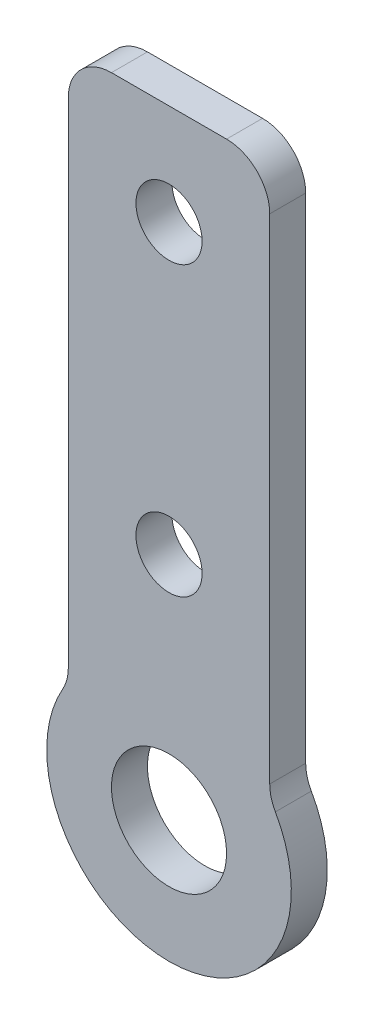
ISO-10303-21;
HEADER;
FILE_DESCRIPTION(('STEP AP214'),'2;1');
FILE_NAME('part.step','',(''),(''),'','','');
FILE_SCHEMA(('AUTOMOTIVE_DESIGN { 1 0 10303 214 1 1 1 1 }'));
ENDSEC;
DATA;
#1=APPLICATION_CONTEXT('core data for automotive mechanical design processes');
#2=APPLICATION_PROTOCOL_DEFINITION('international standard','automotive_design',2000,#1);
#3=PRODUCT_CONTEXT('',#1,'mechanical');
#4=PRODUCT('Part','Part','',(#3));
#5=PRODUCT_RELATED_PRODUCT_CATEGORY('part','',(#4));
#6=PRODUCT_DEFINITION_FORMATION('','',#4);
#7=PRODUCT_DEFINITION_CONTEXT('part definition',#1,'design');
#8=PRODUCT_DEFINITION('design','',#6,#7);
#9=PRODUCT_DEFINITION_SHAPE('','',#8);
#10=(LENGTH_UNIT() NAMED_UNIT(*) SI_UNIT(.MILLI.,.METRE.));
#11=(NAMED_UNIT(*) PLANE_ANGLE_UNIT() SI_UNIT($,.RADIAN.));
#12=(NAMED_UNIT(*) SI_UNIT($,.STERADIAN.) SOLID_ANGLE_UNIT());
#13=UNCERTAINTY_MEASURE_WITH_UNIT(LENGTH_MEASURE(1.E-05),#10,'distance_accuracy_value','');
#14=(GEOMETRIC_REPRESENTATION_CONTEXT(3) GLOBAL_UNCERTAINTY_ASSIGNED_CONTEXT((#13)) GLOBAL_UNIT_ASSIGNED_CONTEXT((#10,
#11,#12)) REPRESENTATION_CONTEXT('',''));
#15=CARTESIAN_POINT('',(0.,0.,0.));
#16=DIRECTION('',(0.,0.,1.));
#17=DIRECTION('',(1.,0.,0.));
#18=AXIS2_PLACEMENT_3D('',#15,#16,#17);
#19=CARTESIAN_POINT('',(0.,0.,1.25));
#20=DIRECTION('',(0.,0.,1.));
#21=DIRECTION('',(1.,0.,0.));
#22=AXIS2_PLACEMENT_3D('',#19,#20,#21);
#23=PLANE('',#22);
#24=CARTESIAN_POINT('',(0.,36.,1.25));
#25=DIRECTION('',(0.,0.,1.));
#26=DIRECTION('',(1.,0.,0.));
#27=AXIS2_PLACEMENT_3D('',#24,#25,#26);
#28=CIRCLE('',#27,2.3);
#29=CARTESIAN_POINT('',(2.3,36.,1.25));
#30=VERTEX_POINT('',#29);
#31=EDGE_CURVE('E306',#30,#30,#28,.T.);
#32=ORIENTED_EDGE('',*,*,#31,.F.);
#33=EDGE_LOOP('',(#32));
#34=FACE_BOUND('',#33,.T.);
#35=DIRECTION('',(0.,1.,0.));
#36=VECTOR('',#35,1.);
#37=CARTESIAN_POINT('',(7.,43.,1.25));
#38=LINE('',#37,#36);
#39=CARTESIAN_POINT('',(7.,5.67890834580027,1.25));
#40=VERTEX_POINT('',#39);
#41=CARTESIAN_POINT('',(7.,40.,1.25));
#42=VERTEX_POINT('',#41);
#43=EDGE_CURVE('E169',#40,#42,#38,.T.);
#44=ORIENTED_EDGE('',*,*,#43,.T.);
#45=CARTESIAN_POINT('',(4.,40.,1.25));
#46=DIRECTION('',(0.,0.,1.));
#47=DIRECTION('',(1.,0.,0.));
#48=AXIS2_PLACEMENT_3D('',#45,#46,#47);
#49=CIRCLE('',#48,3.);
#50=CARTESIAN_POINT('',(4.,43.,1.25));
#51=VERTEX_POINT('',#50);
#52=EDGE_CURVE('E140',#42,#51,#49,.T.);
#53=ORIENTED_EDGE('',*,*,#52,.T.);
#54=DIRECTION('',(-1.,0.,0.));
#55=VECTOR('',#54,1.);
#56=CARTESIAN_POINT('',(-7.,43.,1.25));
#57=LINE('',#56,#55);
#58=CARTESIAN_POINT('',(-4.,43.,1.25));
#59=VERTEX_POINT('',#58);
#60=EDGE_CURVE('E118',#51,#59,#57,.T.);
#61=ORIENTED_EDGE('',*,*,#60,.T.);
#62=CARTESIAN_POINT('',(-4.,40.,1.25));
#63=DIRECTION('',(0.,0.,1.));
#64=DIRECTION('',(1.,0.,0.));
#65=AXIS2_PLACEMENT_3D('',#62,#63,#64);
#66=CIRCLE('',#65,3.);
#67=CARTESIAN_POINT('',(-7.,40.,1.25));
#68=VERTEX_POINT('',#67);
#69=EDGE_CURVE('E55',#59,#68,#66,.T.);
#70=ORIENTED_EDGE('',*,*,#69,.T.);
#71=DIRECTION('',(0.,-1.,0.));
#72=VECTOR('',#71,1.);
#73=CARTESIAN_POINT('',(-7.,4.82182538049648,1.25));
#74=LINE('',#73,#72);
#75=CARTESIAN_POINT('',(-7.,5.67890834580027,1.25));
#76=VERTEX_POINT('',#75);
#77=EDGE_CURVE('E133',#68,#76,#74,.T.);
#78=ORIENTED_EDGE('',*,*,#77,.T.);
#79=CARTESIAN_POINT('',(-10.,5.67890834580027,1.25));
#80=DIRECTION('',(0.,0.,1.));
#81=DIRECTION('',(1.,0.,0.));
#82=AXIS2_PLACEMENT_3D('',#79,#80,#81);
#83=CIRCLE('',#82,3.);
#84=CARTESIAN_POINT('',(-7.39130434782609,4.19745399472194,1.25));
#85=VERTEX_POINT('',#84);
#86=EDGE_CURVE('E153',#76,#85,#83,.F.);
#87=ORIENTED_EDGE('',*,*,#86,.T.);
#88=CARTESIAN_POINT('',(0.,0.,1.25));
#89=DIRECTION('',(0.,0.,1.));
#90=DIRECTION('',(1.,0.,0.));
#91=AXIS2_PLACEMENT_3D('',#88,#89,#90);
#92=CIRCLE('',#91,8.5);
#93=CARTESIAN_POINT('',(7.39130434782609,4.19745399472194,1.25));
#94=VERTEX_POINT('',#93);
#95=EDGE_CURVE('E127',#85,#94,#92,.T.);
#96=ORIENTED_EDGE('',*,*,#95,.T.);
#97=CARTESIAN_POINT('',(10.,5.67890834580027,1.25));
#98=DIRECTION('',(0.,0.,1.));
#99=DIRECTION('',(1.,0.,0.));
#100=AXIS2_PLACEMENT_3D('',#97,#98,#99);
#101=CIRCLE('',#100,3.);
#102=EDGE_CURVE('E11',#94,#40,#101,.F.);
#103=ORIENTED_EDGE('',*,*,#102,.T.);
#104=EDGE_LOOP('',(#44,#53,#61,#70,#78,#87,#96,#103));
#105=FACE_BOUND('',#104,.T.);
#106=CARTESIAN_POINT('',(0.,0.,1.25));
#107=DIRECTION('',(0.,0.,1.));
#108=DIRECTION('',(1.,0.,0.));
#109=AXIS2_PLACEMENT_3D('',#106,#107,#108);
#110=CIRCLE('',#109,4.);
#111=CARTESIAN_POINT('',(4.,0.,1.25));
#112=VERTEX_POINT('',#111);
#113=EDGE_CURVE('E164',#112,#112,#110,.T.);
#114=ORIENTED_EDGE('',*,*,#113,.F.);
#115=EDGE_LOOP('',(#114));
#116=FACE_BOUND('',#115,.T.);
#117=CARTESIAN_POINT('',(0.,16.,1.25));
#118=DIRECTION('',(0.,0.,1.));
#119=DIRECTION('',(1.,0.,0.));
#120=AXIS2_PLACEMENT_3D('',#117,#118,#119);
#121=CIRCLE('',#120,2.3);
#122=CARTESIAN_POINT('',(2.3,16.,1.25));
#123=VERTEX_POINT('',#122);
#124=EDGE_CURVE('E297',#123,#123,#121,.T.);
#125=ORIENTED_EDGE('',*,*,#124,.F.);
#126=EDGE_LOOP('',(#125));
#127=FACE_BOUND('',#126,.T.);
#128=ADVANCED_FACE('F33',(#34,#105,#116,#127),#23,.T.);
#129=CARTESIAN_POINT('',(0.,0.,-1.25));
#130=DIRECTION('',(0.,0.,1.));
#131=DIRECTION('',(1.,0.,0.));
#132=AXIS2_PLACEMENT_3D('',#129,#130,#131);
#133=PLANE('',#132);
#134=DIRECTION('',(-1.,0.,0.));
#135=VECTOR('',#134,1.);
#136=CARTESIAN_POINT('',(-7.,43.,-1.25));
#137=LINE('',#136,#135);
#138=CARTESIAN_POINT('',(4.,43.,-1.25));
#139=VERTEX_POINT('',#138);
#140=CARTESIAN_POINT('',(-4.,43.,-1.25));
#141=VERTEX_POINT('',#140);
#142=EDGE_CURVE('E116',#139,#141,#137,.T.);
#143=ORIENTED_EDGE('',*,*,#142,.F.);
#144=CARTESIAN_POINT('',(4.,40.,-1.25));
#145=DIRECTION('',(0.,0.,1.));
#146=DIRECTION('',(1.,0.,0.));
#147=AXIS2_PLACEMENT_3D('',#144,#145,#146);
#148=CIRCLE('',#147,3.);
#149=CARTESIAN_POINT('',(7.,40.,-1.25));
#150=VERTEX_POINT('',#149);
#151=EDGE_CURVE('E99',#139,#150,#148,.F.);
#152=ORIENTED_EDGE('',*,*,#151,.T.);
#153=DIRECTION('',(0.,1.,0.));
#154=VECTOR('',#153,1.);
#155=CARTESIAN_POINT('',(7.,43.,-1.25));
#156=LINE('',#155,#154);
#157=CARTESIAN_POINT('',(7.,5.67890834580027,-1.25));
#158=VERTEX_POINT('',#157);
#159=EDGE_CURVE('E125',#158,#150,#156,.T.);
#160=ORIENTED_EDGE('',*,*,#159,.F.);
#161=CARTESIAN_POINT('',(10.,5.67890834580027,-1.25));
#162=DIRECTION('',(0.,0.,1.));
#163=DIRECTION('',(1.,0.,0.));
#164=AXIS2_PLACEMENT_3D('',#161,#162,#163);
#165=CIRCLE('',#164,3.);
#166=CARTESIAN_POINT('',(7.39130434782609,4.19745399472194,-1.25));
#167=VERTEX_POINT('',#166);
#168=EDGE_CURVE('E41',#158,#167,#165,.T.);
#169=ORIENTED_EDGE('',*,*,#168,.T.);
#170=CARTESIAN_POINT('',(0.,0.,-1.25));
#171=DIRECTION('',(0.,0.,1.));
#172=DIRECTION('',(1.,0.,0.));
#173=AXIS2_PLACEMENT_3D('',#170,#171,#172);
#174=CIRCLE('',#173,8.5);
#175=CARTESIAN_POINT('',(-7.39130434782609,4.19745399472194,-1.25));
#176=VERTEX_POINT('',#175);
#177=EDGE_CURVE('E129',#176,#167,#174,.T.);
#178=ORIENTED_EDGE('',*,*,#177,.F.);
#179=CARTESIAN_POINT('',(-10.,5.67890834580027,-1.25));
#180=DIRECTION('',(0.,0.,1.));
#181=DIRECTION('',(1.,0.,0.));
#182=AXIS2_PLACEMENT_3D('',#179,#180,#181);
#183=CIRCLE('',#182,3.);
#184=CARTESIAN_POINT('',(-7.,5.67890834580027,-1.25));
#185=VERTEX_POINT('',#184);
#186=EDGE_CURVE('E151',#176,#185,#183,.T.);
#187=ORIENTED_EDGE('',*,*,#186,.T.);
#188=DIRECTION('',(0.,-1.,0.));
#189=VECTOR('',#188,1.);
#190=CARTESIAN_POINT('',(-7.,4.82182538049648,-1.25));
#191=LINE('',#190,#189);
#192=CARTESIAN_POINT('',(-7.,40.,-1.25));
#193=VERTEX_POINT('',#192);
#194=EDGE_CURVE('E124',#193,#185,#191,.T.);
#195=ORIENTED_EDGE('',*,*,#194,.F.);
#196=CARTESIAN_POINT('',(-4.,40.,-1.25));
#197=DIRECTION('',(0.,0.,1.));
#198=DIRECTION('',(1.,0.,0.));
#199=AXIS2_PLACEMENT_3D('',#196,#197,#198);
#200=CIRCLE('',#199,3.);
#201=EDGE_CURVE('E110',#193,#141,#200,.F.);
#202=ORIENTED_EDGE('',*,*,#201,.T.);
#203=EDGE_LOOP('',(#143,#152,#160,#169,#178,#187,#195,#202));
#204=FACE_BOUND('',#203,.T.);
#205=CARTESIAN_POINT('',(0.,0.,-1.25));
#206=DIRECTION('',(0.,0.,1.));
#207=DIRECTION('',(1.,0.,0.));
#208=AXIS2_PLACEMENT_3D('',#205,#206,#207);
#209=CIRCLE('',#208,4.);
#210=CARTESIAN_POINT('',(4.,0.,-1.25));
#211=VERTEX_POINT('',#210);
#212=EDGE_CURVE('E309',#211,#211,#209,.T.);
#213=ORIENTED_EDGE('',*,*,#212,.T.);
#214=EDGE_LOOP('',(#213));
#215=FACE_BOUND('',#214,.T.);
#216=CARTESIAN_POINT('',(0.,36.,-1.25));
#217=DIRECTION('',(0.,0.,1.));
#218=DIRECTION('',(1.,0.,0.));
#219=AXIS2_PLACEMENT_3D('',#216,#217,#218);
#220=CIRCLE('',#219,2.3);
#221=CARTESIAN_POINT('',(2.3,36.,-1.25));
#222=VERTEX_POINT('',#221);
#223=EDGE_CURVE('E303',#222,#222,#220,.T.);
#224=ORIENTED_EDGE('',*,*,#223,.T.);
#225=EDGE_LOOP('',(#224));
#226=FACE_BOUND('',#225,.T.);
#227=CARTESIAN_POINT('',(0.,16.,-1.25));
#228=DIRECTION('',(0.,0.,1.));
#229=DIRECTION('',(1.,0.,0.));
#230=AXIS2_PLACEMENT_3D('',#227,#228,#229);
#231=CIRCLE('',#230,2.3);
#232=CARTESIAN_POINT('',(2.3,16.,-1.25));
#233=VERTEX_POINT('',#232);
#234=EDGE_CURVE('E300',#233,#233,#231,.T.);
#235=ORIENTED_EDGE('',*,*,#234,.T.);
#236=EDGE_LOOP('',(#235));
#237=FACE_BOUND('',#236,.T.);
#238=ADVANCED_FACE('F121',(#204,#215,#226,#237),#133,.F.);
#239=CARTESIAN_POINT('',(0.,0.,1.25));
#240=DIRECTION('',(0.,0.,-1.));
#241=DIRECTION('',(-1.,0.,0.));
#242=AXIS2_PLACEMENT_3D('',#239,#240,#241);
#243=CYLINDRICAL_SURFACE('',#242,8.5);
#244=ORIENTED_EDGE('',*,*,#95,.F.);
#245=DIRECTION('',(0.,0.,-1.));
#246=VECTOR('',#245,1.);
#247=CARTESIAN_POINT('',(-7.39130434782609,4.19745399472194,1.25));
#248=LINE('',#247,#246);
#249=EDGE_CURVE('E148',#85,#176,#248,.T.);
#250=ORIENTED_EDGE('',*,*,#249,.T.);
#251=ORIENTED_EDGE('',*,*,#177,.T.);
#252=DIRECTION('',(0.,0.,-1.));
#253=VECTOR('',#252,1.);
#254=CARTESIAN_POINT('',(7.39130434782609,4.19745399472194,1.25));
#255=LINE('',#254,#253);
#256=EDGE_CURVE('E146',#167,#94,#255,.F.);
#257=ORIENTED_EDGE('',*,*,#256,.T.);
#258=EDGE_LOOP('',(#244,#250,#251,#257));
#259=FACE_BOUND('',#258,.T.);
#260=ADVANCED_FACE('F161',(#259),#243,.T.);
#261=CARTESIAN_POINT('',(7.,43.,1.25));
#262=DIRECTION('',(-1.,0.,0.));
#263=DIRECTION('',(0.,0.,1.));
#264=AXIS2_PLACEMENT_3D('',#261,#262,#263);
#265=PLANE('',#264);
#266=ORIENTED_EDGE('',*,*,#159,.T.);
#267=DIRECTION('',(0.,0.,-1.));
#268=VECTOR('',#267,1.);
#269=CARTESIAN_POINT('',(7.,40.,1.25));
#270=LINE('',#269,#268);
#271=EDGE_CURVE('E104',#150,#42,#270,.F.);
#272=ORIENTED_EDGE('',*,*,#271,.T.);
#273=ORIENTED_EDGE('',*,*,#43,.F.);
#274=DIRECTION('',(0.,0.,1.));
#275=VECTOR('',#274,1.);
#276=CARTESIAN_POINT('',(7.,5.67890834580027,-1.25));
#277=LINE('',#276,#275);
#278=EDGE_CURVE('E109',#40,#158,#277,.F.);
#279=ORIENTED_EDGE('',*,*,#278,.T.);
#280=EDGE_LOOP('',(#266,#272,#273,#279));
#281=FACE_BOUND('',#280,.T.);
#282=ADVANCED_FACE('F171',(#281),#265,.F.);
#283=CARTESIAN_POINT('',(-7.,43.,1.25));
#284=DIRECTION('',(0.,-1.,0.));
#285=DIRECTION('',(0.,0.,-1.));
#286=AXIS2_PLACEMENT_3D('',#283,#284,#285);
#287=PLANE('',#286);
#288=ORIENTED_EDGE('',*,*,#60,.F.);
#289=DIRECTION('',(0.,0.,-1.));
#290=VECTOR('',#289,1.);
#291=CARTESIAN_POINT('',(4.,43.,1.25));
#292=LINE('',#291,#290);
#293=EDGE_CURVE('E103',#51,#139,#292,.T.);
#294=ORIENTED_EDGE('',*,*,#293,.T.);
#295=ORIENTED_EDGE('',*,*,#142,.T.);
#296=DIRECTION('',(0.,0.,-1.));
#297=VECTOR('',#296,1.);
#298=CARTESIAN_POINT('',(-4.,43.,1.25));
#299=LINE('',#298,#297);
#300=EDGE_CURVE('E119',#141,#59,#299,.F.);
#301=ORIENTED_EDGE('',*,*,#300,.T.);
#302=EDGE_LOOP('',(#288,#294,#295,#301));
#303=FACE_BOUND('',#302,.T.);
#304=ADVANCED_FACE('F115',(#303),#287,.F.);
#305=CARTESIAN_POINT('',(-7.,4.82182538049648,1.25));
#306=DIRECTION('',(1.,0.,0.));
#307=DIRECTION('',(0.,0.,-1.));
#308=AXIS2_PLACEMENT_3D('',#305,#306,#307);
#309=PLANE('',#308);
#310=ORIENTED_EDGE('',*,*,#77,.F.);
#311=DIRECTION('',(0.,0.,-1.));
#312=VECTOR('',#311,1.);
#313=CARTESIAN_POINT('',(-7.,40.,1.25));
#314=LINE('',#313,#312);
#315=EDGE_CURVE('E143',#68,#193,#314,.T.);
#316=ORIENTED_EDGE('',*,*,#315,.T.);
#317=ORIENTED_EDGE('',*,*,#194,.T.);
#318=DIRECTION('',(0.,0.,1.));
#319=VECTOR('',#318,1.);
#320=CARTESIAN_POINT('',(-7.,5.67890834580027,1.25));
#321=LINE('',#320,#319);
#322=EDGE_CURVE('E48',#185,#76,#321,.T.);
#323=ORIENTED_EDGE('',*,*,#322,.T.);
#324=EDGE_LOOP('',(#310,#316,#317,#323));
#325=FACE_BOUND('',#324,.T.);
#326=ADVANCED_FACE('F181',(#325),#309,.F.);
#327=CARTESIAN_POINT('',(0.,0.,1.25));
#328=DIRECTION('',(0.,0.,-1.));
#329=DIRECTION('',(-1.,0.,0.));
#330=AXIS2_PLACEMENT_3D('',#327,#328,#329);
#331=CYLINDRICAL_SURFACE('',#330,4.);
#332=ORIENTED_EDGE('',*,*,#113,.T.);
#333=EDGE_LOOP('',(#332));
#334=FACE_BOUND('',#333,.T.);
#335=ORIENTED_EDGE('',*,*,#212,.F.);
#336=EDGE_LOOP('',(#335));
#337=FACE_BOUND('',#336,.T.);
#338=ADVANCED_FACE('F201',(#334,#337),#331,.F.);
#339=CARTESIAN_POINT('',(0.,36.,1.25));
#340=DIRECTION('',(0.,0.,-1.));
#341=DIRECTION('',(-1.,0.,0.));
#342=AXIS2_PLACEMENT_3D('',#339,#340,#341);
#343=CYLINDRICAL_SURFACE('',#342,2.3);
#344=ORIENTED_EDGE('',*,*,#31,.T.);
#345=EDGE_LOOP('',(#344));
#346=FACE_BOUND('',#345,.T.);
#347=ORIENTED_EDGE('',*,*,#223,.F.);
#348=EDGE_LOOP('',(#347));
#349=FACE_BOUND('',#348,.T.);
#350=ADVANCED_FACE('F234',(#346,#349),#343,.F.);
#351=CARTESIAN_POINT('',(0.,16.,1.25));
#352=DIRECTION('',(0.,0.,-1.));
#353=DIRECTION('',(-1.,0.,0.));
#354=AXIS2_PLACEMENT_3D('',#351,#352,#353);
#355=CYLINDRICAL_SURFACE('',#354,2.3);
#356=ORIENTED_EDGE('',*,*,#124,.T.);
#357=EDGE_LOOP('',(#356));
#358=FACE_BOUND('',#357,.T.);
#359=ORIENTED_EDGE('',*,*,#234,.F.);
#360=EDGE_LOOP('',(#359));
#361=FACE_BOUND('',#360,.T.);
#362=ADVANCED_FACE('F190',(#358,#361),#355,.F.);
#363=CARTESIAN_POINT('',(4.,40.,1.25));
#364=DIRECTION('',(0.,0.,-1.));
#365=DIRECTION('',(-1.,0.,0.));
#366=AXIS2_PLACEMENT_3D('',#363,#364,#365);
#367=CYLINDRICAL_SURFACE('',#366,3.);
#368=ORIENTED_EDGE('',*,*,#52,.F.);
#369=ORIENTED_EDGE('',*,*,#271,.F.);
#370=ORIENTED_EDGE('',*,*,#151,.F.);
#371=ORIENTED_EDGE('',*,*,#293,.F.);
#372=EDGE_LOOP('',(#368,#369,#370,#371));
#373=FACE_BOUND('',#372,.T.);
#374=ADVANCED_FACE('F102',(#373),#367,.T.);
#375=CARTESIAN_POINT('',(-4.,40.,1.25));
#376=DIRECTION('',(0.,0.,-1.));
#377=DIRECTION('',(-1.,0.,0.));
#378=AXIS2_PLACEMENT_3D('',#375,#376,#377);
#379=CYLINDRICAL_SURFACE('',#378,3.);
#380=ORIENTED_EDGE('',*,*,#69,.F.);
#381=ORIENTED_EDGE('',*,*,#300,.F.);
#382=ORIENTED_EDGE('',*,*,#201,.F.);
#383=ORIENTED_EDGE('',*,*,#315,.F.);
#384=EDGE_LOOP('',(#380,#381,#382,#383));
#385=FACE_BOUND('',#384,.T.);
#386=ADVANCED_FACE('F183',(#385),#379,.T.);
#387=CARTESIAN_POINT('',(-10.,5.67890834580027,1.25));
#388=DIRECTION('',(0.,0.,-1.));
#389=DIRECTION('',(-1.,0.,0.));
#390=AXIS2_PLACEMENT_3D('',#387,#388,#389);
#391=CYLINDRICAL_SURFACE('',#390,3.);
#392=ORIENTED_EDGE('',*,*,#86,.F.);
#393=ORIENTED_EDGE('',*,*,#322,.F.);
#394=ORIENTED_EDGE('',*,*,#186,.F.);
#395=ORIENTED_EDGE('',*,*,#249,.F.);
#396=EDGE_LOOP('',(#392,#393,#394,#395));
#397=FACE_BOUND('',#396,.T.);
#398=ADVANCED_FACE('F180',(#397),#391,.F.);
#399=CARTESIAN_POINT('',(10.,5.67890834580027,1.25));
#400=DIRECTION('',(0.,0.,-1.));
#401=DIRECTION('',(-1.,0.,0.));
#402=AXIS2_PLACEMENT_3D('',#399,#400,#401);
#403=CYLINDRICAL_SURFACE('',#402,3.);
#404=ORIENTED_EDGE('',*,*,#102,.F.);
#405=ORIENTED_EDGE('',*,*,#256,.F.);
#406=ORIENTED_EDGE('',*,*,#168,.F.);
#407=ORIENTED_EDGE('',*,*,#278,.F.);
#408=EDGE_LOOP('',(#404,#405,#406,#407));
#409=FACE_BOUND('',#408,.T.);
#410=ADVANCED_FACE('F35',(#409),#403,.F.);
#411=CLOSED_SHELL('',(#128,#238,#260,#282,#304,#326,#338,#350,#362,#374,#386,#398,#410));
#412=MANIFOLD_SOLID_BREP('B2',#411);
#413=ADVANCED_BREP_SHAPE_REPRESENTATION('',(#18,#412),#14);
#414=SHAPE_DEFINITION_REPRESENTATION(#9,#413);
ENDSEC;
END-ISO-10303-21;
